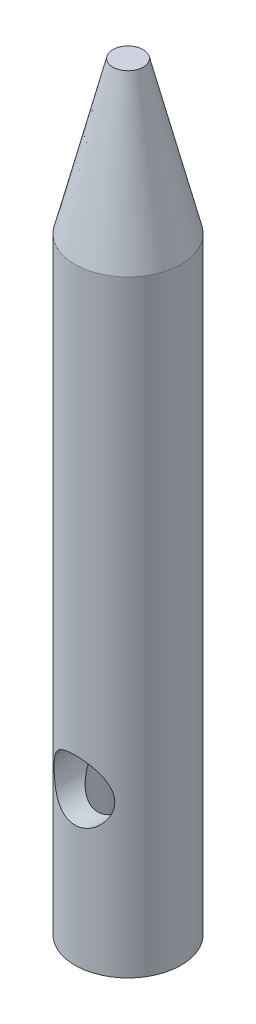
ISO-10303-21;
HEADER;
FILE_DESCRIPTION(('STEP AP214'),'2;1');
FILE_NAME('part.step','',(''),(''),'','','');
FILE_SCHEMA(('AUTOMOTIVE_DESIGN { 1 0 10303 214 1 1 1 1 }'));
ENDSEC;
DATA;
#1=APPLICATION_CONTEXT('core data for automotive mechanical design processes');
#2=APPLICATION_PROTOCOL_DEFINITION('international standard','automotive_design',2000,#1);
#3=PRODUCT_CONTEXT('',#1,'mechanical');
#4=PRODUCT('Part','Part','',(#3));
#5=PRODUCT_RELATED_PRODUCT_CATEGORY('part','',(#4));
#6=PRODUCT_DEFINITION_FORMATION('','',#4);
#7=PRODUCT_DEFINITION_CONTEXT('part definition',#1,'design');
#8=PRODUCT_DEFINITION('design','',#6,#7);
#9=PRODUCT_DEFINITION_SHAPE('','',#8);
#10=(LENGTH_UNIT() NAMED_UNIT(*) SI_UNIT(.MILLI.,.METRE.));
#11=(NAMED_UNIT(*) PLANE_ANGLE_UNIT() SI_UNIT($,.RADIAN.));
#12=(NAMED_UNIT(*) SI_UNIT($,.STERADIAN.) SOLID_ANGLE_UNIT());
#13=UNCERTAINTY_MEASURE_WITH_UNIT(LENGTH_MEASURE(1.E-05),#10,'distance_accuracy_value','');
#14=(GEOMETRIC_REPRESENTATION_CONTEXT(3) GLOBAL_UNCERTAINTY_ASSIGNED_CONTEXT((#13)) GLOBAL_UNIT_ASSIGNED_CONTEXT((#10,
#11,#12)) REPRESENTATION_CONTEXT('',''));
#15=CARTESIAN_POINT('',(0.,0.,0.));
#16=DIRECTION('',(0.,0.,1.));
#17=DIRECTION('',(1.,0.,0.));
#18=AXIS2_PLACEMENT_3D('',#15,#16,#17);
#19=CARTESIAN_POINT('',(0.,0.,0.));
#20=DIRECTION('',(0.,-1.,0.));
#21=DIRECTION('',(0.,0.,-1.));
#22=AXIS2_PLACEMENT_3D('',#19,#20,#21);
#23=CYLINDRICAL_SURFACE('',#22,0.2);
#24=CARTESIAN_POINT('',(0.,0.,0.));
#25=DIRECTION('',(0.,-1.,0.));
#26=DIRECTION('',(0.,0.,-1.));
#27=AXIS2_PLACEMENT_3D('',#24,#25,#26);
#28=CIRCLE('',#27,0.2);
#29=CARTESIAN_POINT('',(0.,0.,-0.2));
#30=VERTEX_POINT('',#29);
#31=EDGE_CURVE('E11',#30,#30,#28,.T.);
#32=ORIENTED_EDGE('',*,*,#31,.T.);
#33=EDGE_LOOP('',(#32));
#34=FACE_BOUND('',#33,.T.);
#35=CARTESIAN_POINT('',(0.,1.,0.));
#36=DIRECTION('',(0.,-0.707106781186547,-0.707106781186547));
#37=DIRECTION('',(0.,-0.707106781186547,0.707106781186547));
#38=AXIS2_PLACEMENT_3D('',#35,#36,#37);
#39=ELLIPSE('',#38,0.282842712474619,0.2);
#40=CARTESIAN_POINT('',(-0.2,1.,0.));
#41=VERTEX_POINT('',#40);
#42=CARTESIAN_POINT('',(0.2,1.,0.));
#43=VERTEX_POINT('',#42);
#44=EDGE_CURVE('E55',#41,#43,#39,.F.);
#45=ORIENTED_EDGE('',*,*,#44,.T.);
#46=CARTESIAN_POINT('',(0.,1.,0.));
#47=DIRECTION('',(0.,-0.707106781186547,0.707106781186547));
#48=DIRECTION('',(0.,-0.707106781186547,-0.707106781186547));
#49=AXIS2_PLACEMENT_3D('',#46,#47,#48);
#50=ELLIPSE('',#49,0.282842712474619,0.2);
#51=EDGE_CURVE('E63',#43,#41,#50,.F.);
#52=ORIENTED_EDGE('',*,*,#51,.T.);
#53=EDGE_LOOP('',(#45,#52));
#54=FACE_BOUND('',#53,.T.);
#55=ADVANCED_FACE('F34',(#34,#54),#23,.F.);
#56=CARTESIAN_POINT('',(-0.35,0.,0.));
#57=DIRECTION('',(0.,1.,0.));
#58=DIRECTION('',(0.,0.,1.));
#59=AXIS2_PLACEMENT_3D('',#56,#57,#58);
#60=PLANE('',#59);
#61=ORIENTED_EDGE('',*,*,#31,.F.);
#62=EDGE_LOOP('',(#61));
#63=FACE_BOUND('',#62,.T.);
#64=CARTESIAN_POINT('',(0.,0.,0.));
#65=DIRECTION('',(0.,-1.,0.));
#66=DIRECTION('',(0.,0.,-1.));
#67=AXIS2_PLACEMENT_3D('',#64,#65,#66);
#68=CIRCLE('',#67,0.35);
#69=CARTESIAN_POINT('',(0.,0.,-0.35));
#70=VERTEX_POINT('',#69);
#71=EDGE_CURVE('E71',#70,#70,#68,.T.);
#72=ORIENTED_EDGE('',*,*,#71,.T.);
#73=EDGE_LOOP('',(#72));
#74=FACE_BOUND('',#73,.T.);
#75=ADVANCED_FACE('F36',(#63,#74),#60,.F.);
#76=CARTESIAN_POINT('',(0.,5.,0.));
#77=DIRECTION('',(0.,-1.,0.));
#78=DIRECTION('',(0.,0.,-1.));
#79=AXIS2_PLACEMENT_3D('',#76,#77,#78);
#80=PLANE('',#79);
#81=CARTESIAN_POINT('',(0.,5.,0.));
#82=DIRECTION('',(0.,-1.,0.));
#83=DIRECTION('',(0.,0.,-1.));
#84=AXIS2_PLACEMENT_3D('',#81,#82,#83);
#85=CIRCLE('',#84,0.100000000000001);
#86=CARTESIAN_POINT('',(0.,5.,-0.100000000000001));
#87=VERTEX_POINT('',#86);
#88=EDGE_CURVE('E82',#87,#87,#85,.T.);
#89=ORIENTED_EDGE('',*,*,#88,.F.);
#90=EDGE_LOOP('',(#89));
#91=FACE_BOUND('',#90,.T.);
#92=ADVANCED_FACE('F112',(#91),#80,.F.);
#93=CARTESIAN_POINT('',(0.,5.,0.));
#94=DIRECTION('',(0.,-1.,0.));
#95=DIRECTION('',(0.,0.,-1.));
#96=AXIS2_PLACEMENT_3D('',#93,#94,#95);
#97=CONICAL_SURFACE('',#96,0.100000000000001,0.244978663126864);
#98=CARTESIAN_POINT('',(0.,4.,0.));
#99=DIRECTION('',(0.,-1.,0.));
#100=DIRECTION('',(0.,0.,-1.));
#101=AXIS2_PLACEMENT_3D('',#98,#99,#100);
#102=CIRCLE('',#101,0.35);
#103=CARTESIAN_POINT('',(0.,4.,-0.35));
#104=VERTEX_POINT('',#103);
#105=EDGE_CURVE('E79',#104,#104,#102,.T.);
#106=CARTESIAN_POINT('',(0.,4.,-0.35));
#107=CARTESIAN_POINT('',(0.,4.01041666666667,-0.347395833333334));
#108=CARTESIAN_POINT('',(0.,4.02083333333333,-0.344791666666667));
#109=CARTESIAN_POINT('',(0.,4.04166666666667,-0.339583333333334));
#110=CARTESIAN_POINT('',(0.,4.05208333333333,-0.336979166666667));
#111=CARTESIAN_POINT('',(0.,4.07291666666667,-0.331770833333334));
#112=CARTESIAN_POINT('',(0.,4.08333333333333,-0.329166666666667));
#113=CARTESIAN_POINT('',(0.,4.10416666666667,-0.323958333333334));
#114=CARTESIAN_POINT('',(0.,4.11458333333333,-0.321354166666667));
#115=CARTESIAN_POINT('',(0.,4.13541666666667,-0.316145833333334));
#116=CARTESIAN_POINT('',(0.,4.14583333333333,-0.313541666666667));
#117=CARTESIAN_POINT('',(0.,4.16666666666667,-0.308333333333334));
#118=CARTESIAN_POINT('',(0.,4.17708333333333,-0.305729166666667));
#119=CARTESIAN_POINT('',(0.,4.19791666666667,-0.300520833333334));
#120=CARTESIAN_POINT('',(0.,4.20833333333333,-0.297916666666667));
#121=CARTESIAN_POINT('',(0.,4.22916666666667,-0.292708333333334));
#122=CARTESIAN_POINT('',(0.,4.23958333333333,-0.290104166666667));
#123=CARTESIAN_POINT('',(0.,4.26041666666667,-0.284895833333334));
#124=CARTESIAN_POINT('',(0.,4.27083333333333,-0.282291666666667));
#125=CARTESIAN_POINT('',(0.,4.29166666666667,-0.277083333333334));
#126=CARTESIAN_POINT('',(0.,4.30208333333333,-0.274479166666667));
#127=CARTESIAN_POINT('',(0.,4.32291666666667,-0.269270833333334));
#128=CARTESIAN_POINT('',(0.,4.33333333333333,-0.266666666666667));
#129=CARTESIAN_POINT('',(0.,4.35416666666667,-0.261458333333334));
#130=CARTESIAN_POINT('',(0.,4.36458333333333,-0.258854166666667));
#131=CARTESIAN_POINT('',(0.,4.38541666666667,-0.253645833333334));
#132=CARTESIAN_POINT('',(0.,4.39583333333333,-0.251041666666667));
#133=CARTESIAN_POINT('',(0.,4.41666666666667,-0.245833333333334));
#134=CARTESIAN_POINT('',(0.,4.42708333333333,-0.243229166666667));
#135=CARTESIAN_POINT('',(0.,4.44791666666667,-0.238020833333334));
#136=CARTESIAN_POINT('',(0.,4.45833333333333,-0.235416666666667));
#137=CARTESIAN_POINT('',(0.,4.47916666666667,-0.230208333333334));
#138=CARTESIAN_POINT('',(0.,4.48958333333333,-0.227604166666667));
#139=CARTESIAN_POINT('',(0.,4.51041666666667,-0.222395833333334));
#140=CARTESIAN_POINT('',(0.,4.52083333333333,-0.219791666666667));
#141=CARTESIAN_POINT('',(0.,4.54166666666667,-0.214583333333334));
#142=CARTESIAN_POINT('',(0.,4.55208333333333,-0.211979166666667));
#143=CARTESIAN_POINT('',(0.,4.57291666666667,-0.206770833333334));
#144=CARTESIAN_POINT('',(0.,4.58333333333333,-0.204166666666667));
#145=CARTESIAN_POINT('',(0.,4.60416666666667,-0.198958333333334));
#146=CARTESIAN_POINT('',(0.,4.61458333333333,-0.196354166666667));
#147=CARTESIAN_POINT('',(0.,4.63541666666667,-0.191145833333334));
#148=CARTESIAN_POINT('',(0.,4.64583333333333,-0.188541666666667));
#149=CARTESIAN_POINT('',(0.,4.66666666666667,-0.183333333333334));
#150=CARTESIAN_POINT('',(0.,4.67708333333333,-0.180729166666667));
#151=CARTESIAN_POINT('',(0.,4.69791666666667,-0.175520833333334));
#152=CARTESIAN_POINT('',(0.,4.70833333333333,-0.172916666666667));
#153=CARTESIAN_POINT('',(0.,4.72916666666667,-0.167708333333334));
#154=CARTESIAN_POINT('',(0.,4.73958333333333,-0.165104166666667));
#155=CARTESIAN_POINT('',(0.,4.76041666666667,-0.159895833333334));
#156=CARTESIAN_POINT('',(0.,4.77083333333333,-0.157291666666667));
#157=CARTESIAN_POINT('',(0.,4.79166666666667,-0.152083333333334));
#158=CARTESIAN_POINT('',(0.,4.80208333333333,-0.149479166666667));
#159=CARTESIAN_POINT('',(0.,4.82291666666667,-0.144270833333334));
#160=CARTESIAN_POINT('',(0.,4.83333333333333,-0.141666666666667));
#161=CARTESIAN_POINT('',(0.,4.85416666666667,-0.136458333333334));
#162=CARTESIAN_POINT('',(0.,4.86458333333333,-0.133854166666667));
#163=CARTESIAN_POINT('',(0.,4.88541666666667,-0.128645833333334));
#164=CARTESIAN_POINT('',(0.,4.89583333333333,-0.126041666666667));
#165=CARTESIAN_POINT('',(0.,4.91666666666667,-0.120833333333334));
#166=CARTESIAN_POINT('',(0.,4.92708333333333,-0.118229166666667));
#167=CARTESIAN_POINT('',(0.,4.94791666666667,-0.113020833333334));
#168=CARTESIAN_POINT('',(0.,4.95833333333333,-0.110416666666667));
#169=CARTESIAN_POINT('',(0.,4.97916666666667,-0.105208333333334));
#170=CARTESIAN_POINT('',(0.,4.98958333333333,-0.102604166666667));
#171=CARTESIAN_POINT('',(0.,5.,-0.100000000000001));
#172=B_SPLINE_CURVE_WITH_KNOTS('',3,(#106,#107,#108,#109,#110,#111,#112,#113,#114,#115,#116,
#117,#118,#119,#120,#121,#122,#123,#124,#125,#126,#127,#128,#129,#130,#131,#132,#133,#134,#135,
#136,#137,#138,#139,#140,#141,#142,#143,#144,#145,#146,#147,#148,#149,#150,#151,#152,#153,#154,
#155,#156,#157,#158,#159,#160,#161,#162,#163,#164,#165,#166,#167,#168,#169,#170,#171),
.UNSPECIFIED.,.F.,.F.,(4,2,2,2,2,2,2,2,2,2,2,2,2,2,2,2,2,2,2,2,2,2,2,2,2,2,2,2,2,2,2,2,4),(0.,
0.032211762700138,0.064423525400276,0.096635288100414,0.128847050800552,0.16105881350069,
0.193270576200828,0.225482338900966,0.257694101601104,0.289905864301242,0.32211762700138,
0.354329389701518,0.386541152401656,0.418752915101794,0.450964677801932,0.48317644050207,
0.515388203202208,0.547599965902346,0.579811728602484,0.612023491302622,0.64423525400276,
0.676447016702898,0.708658779403036,0.740870542103174,0.773082304803312,0.80529406750345,
0.837505830203588,0.869717592903726,0.901929355603864,0.934141118304002,0.96635288100414,
0.998564643704278,1.03077640640442),.UNSPECIFIED.);
#173=EDGE_CURVE('BSEAM133',#104,#87,#172,.T.);
#174=ORIENTED_EDGE('',*,*,#105,.F.);
#175=ORIENTED_EDGE('',*,*,#88,.T.);
#176=ORIENTED_EDGE('',*,*,#173,.T.);
#177=ORIENTED_EDGE('',*,*,#173,.F.);
#178=EDGE_LOOP('',(#174,#176,#175,#177));
#179=FACE_BOUND('',#178,.T.);
#180=ADVANCED_FACE('F133',(#179),#97,.T.);
#181=CARTESIAN_POINT('',(0.,0.,0.));
#182=DIRECTION('',(0.,-1.,0.));
#183=DIRECTION('',(0.,0.,-1.));
#184=AXIS2_PLACEMENT_3D('',#181,#182,#183);
#185=CYLINDRICAL_SURFACE('',#184,0.35);
#186=CARTESIAN_POINT('',(0.,1.2,-0.35));
#187=CARTESIAN_POINT('',(-0.0103137633713756,1.19999876478273,-0.349998930544013));
#188=CARTESIAN_POINT('',(-0.0206422734256984,1.19919674742983,-0.349539051709204));
#189=CARTESIAN_POINT('',(-0.0409933767093107,1.19602603667917,-0.347742132318733));
#190=CARTESIAN_POINT('',(-0.0510151115294479,1.19365330488609,-0.346402830789807));
#191=CARTESIAN_POINT('',(-0.0704137878038646,1.18747006739084,-0.342984596297375));
#192=CARTESIAN_POINT('',(-0.0797935488228526,1.18366639927172,-0.340909183422635));
#193=CARTESIAN_POINT('',(-0.0977565699945647,1.17476902760964,-0.336199342025411));
#194=CARTESIAN_POINT('',(-0.106340051171244,1.1696756835157,-0.333565069297356));
#195=CARTESIAN_POINT('',(-0.123168344046356,1.15793141604813,-0.327741425104897));
#196=CARTESIAN_POINT('',(-0.131343892888419,1.15119455155795,-0.324525700186589));
#197=CARTESIAN_POINT('',(-0.146516454500345,1.13654426694702,-0.31796447699383));
#198=CARTESIAN_POINT('',(-0.153512064477469,1.12862946715736,-0.314618829989264));
#199=CARTESIAN_POINT('',(-0.166894421303945,1.11083035772255,-0.307747838458372));
#200=CARTESIAN_POINT('',(-0.17313237753777,1.10082548711314,-0.304242478886067));
#201=CARTESIAN_POINT('',(-0.183811251661301,1.07970497289213,-0.297913019998135));
#202=CARTESIAN_POINT('',(-0.188254890035744,1.06859104295207,-0.295087891983905));
#203=CARTESIAN_POINT('',(-0.194359344849944,1.04808548353295,-0.291092239002123));
#204=CARTESIAN_POINT('',(-0.196418339952736,1.03885684851674,-0.289693926376122));
#205=CARTESIAN_POINT('',(-0.199210676215421,1.02011502636096,-0.287781339696641));
#206=CARTESIAN_POINT('',(-0.199945438410471,1.01060215539654,-0.287266118026827));
#207=CARTESIAN_POINT('',(-0.200048758471699,0.991552531514157,-0.2871941873633));
#208=CARTESIAN_POINT('',(-0.199415450552132,0.982015763721244,-0.287638787382113));
#209=CARTESIAN_POINT('',(-0.196816496401727,0.963209749567018,-0.289422948006508));
#210=CARTESIAN_POINT('',(-0.194849933467719,0.953940691849278,-0.290763124372431));
#211=CARTESIAN_POINT('',(-0.189691752764124,0.935933506937481,-0.294153701069832));
#212=CARTESIAN_POINT('',(-0.186504898447889,0.927193466441864,-0.2962013368077));
#213=CARTESIAN_POINT('',(-0.17901699553948,0.910345014740466,-0.300785886726075));
#214=CARTESIAN_POINT('',(-0.174715520650386,0.90223684674684,-0.303322988012138));
#215=CARTESIAN_POINT('',(-0.164323768381055,0.885502710460292,-0.309092813686719));
#216=CARTESIAN_POINT('',(-0.158057296974719,0.877001985826451,-0.312371858594242));
#217=CARTESIAN_POINT('',(-0.144275323922769,0.861091568050594,-0.318971935686018));
#218=CARTESIAN_POINT('',(-0.136758757586163,0.853682815161013,-0.322293001412018));
#219=CARTESIAN_POINT('',(-0.119664071603784,0.839317579858433,-0.329050445600129));
#220=CARTESIAN_POINT('',(-0.109948658535053,0.832508704888142,-0.332456879733462));
#221=CARTESIAN_POINT('',(-0.0893015490655802,0.820649320854548,-0.338586602557162));
#222=CARTESIAN_POINT('',(-0.0783706249477172,0.815597703634876,-0.341310321475285));
#223=CARTESIAN_POINT('',(-0.0563793778179125,0.807781607577393,-0.345598032097026));
#224=CARTESIAN_POINT('',(-0.0453802193453631,0.804883178938477,-0.347229170031787));
#225=CARTESIAN_POINT('',(-0.0229493069556982,0.800996184112126,-0.349427902499712));
#226=CARTESIAN_POINT('',(-0.0115179910205493,0.80000573447666,-0.34999654585023));
#227=CARTESIAN_POINT('',(0.00995234593134536,0.799994998886615,-0.350003013582763));
#228=CARTESIAN_POINT('',(0.0199920938989525,0.800750353381575,-0.349569611836485));
#229=CARTESIAN_POINT('',(0.0397754958971078,0.803740057339511,-0.347874174583042));
#230=CARTESIAN_POINT('',(0.0495191448486255,0.805974432157383,-0.346612124870339));
#231=CARTESIAN_POINT('',(0.0683570804723404,0.811788463846716,-0.343391644887802));
#232=CARTESIAN_POINT('',(0.0774570013012234,0.815354090994125,-0.341440488141792));
#233=CARTESIAN_POINT('',(0.0949355356164595,0.823701573604684,-0.336999496877669));
#234=CARTESIAN_POINT('',(0.103313974782479,0.828483721899349,-0.3345095326836));
#235=CARTESIAN_POINT('',(0.12005099711777,0.839689384085905,-0.328897467992497));
#236=CARTESIAN_POINT('',(0.128316737085758,0.846231933816732,-0.325736546623625));
#237=CARTESIAN_POINT('',(0.143697220197717,0.860496166111818,-0.319250590832059));
#238=CARTESIAN_POINT('',(0.150810627029033,0.868219197752364,-0.315925371627119));
#239=CARTESIAN_POINT('',(0.164492727997804,0.885640252382802,-0.309042173576713));
#240=CARTESIAN_POINT('',(0.170912186717738,0.895462479866779,-0.305499597340533));
#241=CARTESIAN_POINT('',(0.181993376294319,0.916235463133991,-0.299031347365693));
#242=CARTESIAN_POINT('',(0.186657443128426,0.927184694261494,-0.29610485607864));
#243=CARTESIAN_POINT('',(0.193222109233617,0.947523526415878,-0.291851233596818));
#244=CARTESIAN_POINT('',(0.195499953465304,0.95674764916306,-0.290316106114746));
#245=CARTESIAN_POINT('',(0.198724336733945,0.97552340929629,-0.288119032880242));
#246=CARTESIAN_POINT('',(0.199672390609477,0.985074661298821,-0.287456093622934));
#247=CARTESIAN_POINT('',(0.200185191677465,1.00425227697593,-0.287099311887075));
#248=CARTESIAN_POINT('',(0.199747153848269,1.01387875305667,-0.2874074204933));
#249=CARTESIAN_POINT('',(0.19750838376924,1.03289771506714,-0.288950140141947));
#250=CARTESIAN_POINT('',(0.19570678964257,1.04229004912025,-0.290185337174424));
#251=CARTESIAN_POINT('',(0.190877044137355,1.06043756332218,-0.293383807744768));
#252=CARTESIAN_POINT('',(0.187870654270717,1.06920095589756,-0.295334114159182));
#253=CARTESIAN_POINT('',(0.1807421898435,1.08611990950169,-0.299749553228983));
#254=CARTESIAN_POINT('',(0.176619703864873,1.09427524497029,-0.302214875654131));
#255=CARTESIAN_POINT('',(0.166643167425522,1.11108433360805,-0.307843523342815));
#256=CARTESIAN_POINT('',(0.160620231366455,1.11962145930068,-0.311055874313167));
#257=CARTESIAN_POINT('',(0.147338606531218,1.1356457621163,-0.317562733712144));
#258=CARTESIAN_POINT('',(0.140078845686174,1.14313201799892,-0.320857311281484));
#259=CARTESIAN_POINT('',(0.12345478348927,1.15778607761002,-0.327641814497145));
#260=CARTESIAN_POINT('',(0.113941003655711,1.16479825914288,-0.331105012510977));
#261=CARTESIAN_POINT('',(0.0936681847964059,1.17710585795227,-0.337399606263743));
#262=CARTESIAN_POINT('',(0.0829098475795821,1.1824022364319,-0.340231355465969));
#263=CARTESIAN_POINT('',(0.0624381425690691,1.19026177881628,-0.34451532091275));
#264=CARTESIAN_POINT('',(0.0528790185434741,1.19314345567461,-0.346123290138661));
#265=CARTESIAN_POINT('',(0.0333576138353662,1.19744999837248,-0.348544434076357));
#266=CARTESIAN_POINT('',(0.0233965852105429,1.19887907261361,-0.349359904469659));
#267=CARTESIAN_POINT('',(0.00892909346661869,1.19985092718937,-0.349914901768206));
#268=CARTESIAN_POINT('',(0.00446592919685434,1.20000053485742,-0.350000463081666));
#269=CARTESIAN_POINT('',(0.,1.2,-0.35));
#270=B_SPLINE_CURVE_WITH_KNOTS('',3,(#186,#187,#188,#189,#190,#191,#192,#193,#194,#195,#196,
#197,#198,#199,#200,#201,#202,#203,#204,#205,#206,#207,#208,#209,#210,#211,#212,#213,#214,#215,
#216,#217,#218,#219,#220,#221,#222,#223,#224,#225,#226,#227,#228,#229,#230,#231,#232,#233,#234,
#235,#236,#237,#238,#239,#240,#241,#242,#243,#244,#245,#246,#247,#248,#249,#250,#251,#252,#253,
#254,#255,#256,#257,#258,#259,#260,#261,#262,#263,#264,#265,#266,#267,#268,#269),.UNSPECIFIED.,
.T.,.F.,(4,2,2,2,2,2,2,2,2,2,2,2,2,2,2,2,2,2,2,2,2,2,2,2,2,2,2,2,2,2,2,2,2,2,2,2,2,2,2,2,2,4),
(0.,0.0309268603260588,0.0619335457908361,0.0927939130491701,0.123645688582088,
0.156726264134176,0.189845895106408,0.22656484043951,0.263227902790326,0.291779157002758,
0.320299754562449,0.348859273311803,0.377438448607168,0.405907182915263,0.434386821465276,
0.467430361731442,0.500502190277474,0.537340568255365,0.574155673036686,0.60842618095814,
0.642662841618566,0.672747547984674,0.702832770107277,0.732609492531286,0.762393389370003,
0.795277462996164,0.828199402066336,0.864793130617147,0.90133798863473,0.930087929264483,
0.958805092556715,0.987579992770442,1.01637309623194,1.04466801483725,1.07297337781877,
1.10563737116695,1.13832982278444,1.17509152683508,1.21183260100354,1.24204193491264,
1.27216349635519,1.28555503575006),.UNSPECIFIED.);
#271=CARTESIAN_POINT('',(0.,1.2,-0.35));
#272=VERTEX_POINT('',#271);
#273=EDGE_CURVE('E38',#272,#272,#270,.T.);
#274=ORIENTED_EDGE('',*,*,#273,.T.);
#275=EDGE_LOOP('',(#274));
#276=FACE_BOUND('',#275,.T.);
#277=CARTESIAN_POINT('',(0.2,1.,0.287228132326902));
#278=CARTESIAN_POINT('',(0.199999795574422,0.989824071707422,0.287228454570406));
#279=CARTESIAN_POINT('',(0.199218519270851,0.97964667283571,0.287777067592459));
#280=CARTESIAN_POINT('',(0.196144931078096,0.95962654045965,0.289880046719518));
#281=CARTESIAN_POINT('',(0.193851008064158,0.949784175568541,0.291435485164933));
#282=CARTESIAN_POINT('',(0.187896057659059,0.93076214993464,0.29530907625565));
#283=CARTESIAN_POINT('',(0.184243903139666,0.921578639716486,0.297622267317477));
#284=CARTESIAN_POINT('',(0.175704253700131,0.903958400102295,0.302742059279572));
#285=CARTESIAN_POINT('',(0.170816362796526,0.895521911256564,0.305548818252442));
#286=CARTESIAN_POINT('',(0.159317521330899,0.878618065870515,0.311712928789809));
#287=CARTESIAN_POINT('',(0.152576320709179,0.87024899346755,0.315096898365728));
#288=CARTESIAN_POINT('',(0.137830388140012,0.854680209213615,0.321820634491318));
#289=CARTESIAN_POINT('',(0.129824840205109,0.847481258669342,0.325160370974557));
#290=CARTESIAN_POINT('',(0.111854160270882,0.833783291506497,0.331796239640569));
#291=CARTESIAN_POINT('',(0.101775177832484,0.82741545717586,0.335058180750354));
#292=CARTESIAN_POINT('',(0.0804671960590391,0.816511913000519,0.340802542899649));
#293=CARTESIAN_POINT('',(0.069239157031421,0.811974688674732,0.343285607930658));
#294=CARTESIAN_POINT('',(0.0470016279358293,0.805286189960607,0.346996336372138));
#295=CARTESIAN_POINT('',(0.0360605805974349,0.802959435836291,0.348315582593055));
#296=CARTESIAN_POINT('',(0.013871371211644,0.800169299604951,0.349901289726849));
#297=CARTESIAN_POINT('',(0.00262347176942166,0.799704371572088,0.35016862406812));
#298=CARTESIAN_POINT('',(-0.0184946963787956,0.800608689984018,0.349652510241004));
#299=CARTESIAN_POINT('',(-0.0283772577168577,0.801776975643908,0.348984178266428));
#300=CARTESIAN_POINT('',(-0.0477779282720162,0.805539452444606,0.346860910566025));
#301=CARTESIAN_POINT('',(-0.0572960106221636,0.808133748485748,0.345405916971839));
#302=CARTESIAN_POINT('',(-0.0758178496763568,0.814665099229942,0.341820908136946));
#303=CARTESIAN_POINT('',(-0.0848162877384954,0.818613874742238,0.339685012593584));
#304=CARTESIAN_POINT('',(-0.102037827752191,0.827711784115966,0.334915268758867));
#305=CARTESIAN_POINT('',(-0.110260700078914,0.832861271919931,0.33228127368251));
#306=CARTESIAN_POINT('',(-0.126692918503186,0.844874592132402,0.326394555301744));
#307=CARTESIAN_POINT('',(-0.134795656057991,0.851866415839957,0.323105548166149));
#308=CARTESIAN_POINT('',(-0.149778980710802,0.86703346595053,0.316439037237392));
#309=CARTESIAN_POINT('',(-0.156658064651003,0.875210125767827,0.313061430368862));
#310=CARTESIAN_POINT('',(-0.169686219897269,0.893488022285359,0.306212243143725));
#311=CARTESIAN_POINT('',(-0.175694261459526,0.903699844164044,0.302764831167346));
#312=CARTESIAN_POINT('',(-0.185868169503516,0.925207752583691,0.296628701863718));
#313=CARTESIAN_POINT('',(-0.190037300063656,0.93650187429027,0.293938643325517));
#314=CARTESIAN_POINT('',(-0.195587400148596,0.95719095907647,0.290265363223014));
#315=CARTESIAN_POINT('',(-0.197388069307126,0.966429134279582,0.289032429585663));
#316=CARTESIAN_POINT('',(-0.199669026161666,0.985138817160011,0.287461858924007));
#317=CARTESIAN_POINT('',(-0.200150579794895,0.994610092318435,0.287123363530537));
#318=CARTESIAN_POINT('',(-0.19976686309119,1.0135163431742,0.287390377684484));
#319=CARTESIAN_POINT('',(-0.198900796377874,1.02295129410213,0.287996445421919));
#320=CARTESIAN_POINT('',(-0.195870152830819,1.04151495957625,0.29006574775467));
#321=CARTESIAN_POINT('',(-0.193704629982478,1.05064344589629,0.291529606810779));
#322=CARTESIAN_POINT('',(-0.188140846835327,1.06849532819092,0.295150911588424));
#323=CARTESIAN_POINT('',(-0.184727488276401,1.07721221947902,0.297316813691575));
#324=CARTESIAN_POINT('',(-0.176785702988746,1.09398419587632,0.302106419586968));
#325=CARTESIAN_POINT('',(-0.1722568213872,1.10203900922094,0.304730310003968));
#326=CARTESIAN_POINT('',(-0.161341400894269,1.11867473184882,0.310666399742933));
#327=CARTESIAN_POINT('',(-0.154771199603915,1.12712047148759,0.314020508069561));
#328=CARTESIAN_POINT('',(-0.140365915117554,1.14286857212525,0.320718874487804));
#329=CARTESIAN_POINT('',(-0.132529785443711,1.15016997723825,0.32406312207891));
#330=CARTESIAN_POINT('',(-0.11486749469659,1.16414787390584,0.330761562309973));
#331=CARTESIAN_POINT('',(-0.104920745926269,1.17068912634182,0.334083391106925));
#332=CARTESIAN_POINT('',(-0.0838502048903258,1.1819658447233,0.339983021541056));
#333=CARTESIAN_POINT('',(-0.0727273517759619,1.18670273779256,0.342561410793645));
#334=CARTESIAN_POINT('',(-0.050569756822564,1.19382164247036,0.346494999115034));
#335=CARTESIAN_POINT('',(-0.0396016146177104,1.19636402141799,0.347932715272042));
#336=CARTESIAN_POINT('',(-0.0173110532524938,1.19956646331974,0.349749840717739));
#337=CARTESIAN_POINT('',(-0.00598895624756798,1.20022819028205,0.350130185566166));
#338=CARTESIAN_POINT('',(0.0152663446388147,1.19966629930359,0.34980950736595));
#339=CARTESIAN_POINT('',(0.0252078181064032,1.19865316276306,0.349229198229488));
#340=CARTESIAN_POINT('',(0.044751642437318,1.19518141403517,0.347266080925354));
#341=CARTESIAN_POINT('',(0.0543539754940795,1.19272272606841,0.345883230686522));
#342=CARTESIAN_POINT('',(0.0729940626918306,1.18646387409123,0.342435356756899));
#343=CARTESIAN_POINT('',(0.0820308611690926,1.18266150788743,0.34036921355616));
#344=CARTESIAN_POINT('',(0.0993497634912731,1.1738508608317,0.335723286822077));
#345=CARTESIAN_POINT('',(0.107631659934331,1.16884224994432,0.333143362748848));
#346=CARTESIAN_POINT('',(0.124182171167654,1.15713852762274,0.327358852164431));
#347=CARTESIAN_POINT('',(0.132349322177474,1.150318571721,0.324116776376456));
#348=CARTESIAN_POINT('',(0.147489022304019,1.13549693048814,0.317514349357915));
#349=CARTESIAN_POINT('',(0.154460124934564,1.12749383574764,0.314153860755918));
#350=CARTESIAN_POINT('',(0.167746044899173,1.1095386983968,0.307282960159727));
#351=CARTESIAN_POINT('',(0.173915916122719,1.09947035550981,0.303793640810932));
#352=CARTESIAN_POINT('',(0.184444649266477,1.07823081720529,0.297519675447434));
#353=CARTESIAN_POINT('',(0.188806476764546,1.06706146523217,0.294733878462725));
#354=CARTESIAN_POINT('',(0.194723136206288,1.04657257608753,0.290847763385743));
#355=CARTESIAN_POINT('',(0.196692818357548,1.03741836592388,0.289507162941057));
#356=CARTESIAN_POINT('',(0.199330737579489,1.01884301912002,0.287697604965808));
#357=CARTESIAN_POINT('',(0.200000189282624,1.00942213995018,0.28722783395379));
#358=CARTESIAN_POINT('',(0.2,1.,0.287228132326902));
#359=B_SPLINE_CURVE_WITH_KNOTS('',3,(#277,#278,#279,#280,#281,#282,#283,#284,#285,#286,#287,
#288,#289,#290,#291,#292,#293,#294,#295,#296,#297,#298,#299,#300,#301,#302,#303,#304,#305,#306,
#307,#308,#309,#310,#311,#312,#313,#314,#315,#316,#317,#318,#319,#320,#321,#322,#323,#324,#325,
#326,#327,#328,#329,#330,#331,#332,#333,#334,#335,#336,#337,#338,#339,#340,#341,#342,#343,#344,
#345,#346,#347,#348,#349,#350,#351,#352,#353,#354,#355,#356,#357,#358),.UNSPECIFIED.,.T.,.F.,(4,
2,2,2,2,2,2,2,2,2,2,2,2,2,2,2,2,2,2,2,2,2,2,2,2,2,2,2,2,2,2,2,2,2,2,2,2,2,2,2,4),(0.,
0.0304883874922045,0.0610093008270222,0.0913342368016236,0.121668902543367,0.155333694493002,
0.189020302564242,0.225902542593062,0.262754206715988,0.296347760855559,0.32991341554458,
0.359693222039792,0.389475219493689,0.419521719762526,0.449577088274961,0.483030033342326,
0.516523792999545,0.553354788732138,0.590120143516875,0.618472748181874,0.646798133689516,
0.675140264444833,0.703503053576374,0.732221037095133,0.760950750285232,0.794456853113989,
0.827990796791318,0.864873850490141,0.901727671364317,0.935580044650243,0.969402455885487,
0.999288075875144,1.02917526268339,1.05911166140059,1.08905626021165,1.12229136701959,
1.15556638888968,1.19232239847193,1.22901787948671,1.25727422920921,1.28550417006054),.UNSPECIFIED.);
#360=CARTESIAN_POINT('',(0.2,1.,0.287228132326902));
#361=VERTEX_POINT('',#360);
#362=EDGE_CURVE('E86',#361,#361,#359,.T.);
#363=ORIENTED_EDGE('',*,*,#362,.T.);
#364=EDGE_LOOP('',(#363));
#365=FACE_BOUND('',#364,.T.);
#366=ORIENTED_EDGE('',*,*,#71,.F.);
#367=EDGE_LOOP('',(#366));
#368=FACE_BOUND('',#367,.T.);
#369=ORIENTED_EDGE('',*,*,#105,.T.);
#370=EDGE_LOOP('',(#369));
#371=FACE_BOUND('',#370,.T.);
#372=ADVANCED_FACE('F91',(#276,#365,#368,#371),#185,.T.);
#373=CARTESIAN_POINT('',(0.,1.,-5.));
#374=DIRECTION('',(0.,0.,1.));
#375=DIRECTION('',(1.,0.,0.));
#376=AXIS2_PLACEMENT_3D('',#373,#374,#375);
#377=CYLINDRICAL_SURFACE('',#376,0.2);
#378=ORIENTED_EDGE('',*,*,#362,.F.);
#379=EDGE_LOOP('',(#378));
#380=FACE_BOUND('',#379,.T.);
#381=ORIENTED_EDGE('',*,*,#44,.F.);
#382=CARTESIAN_POINT('',(0.,1.,0.));
#383=DIRECTION('',(0.,-0.707106781186547,0.707106781186547));
#384=DIRECTION('',(0.,-0.707106781186547,-0.707106781186547));
#385=AXIS2_PLACEMENT_3D('',#382,#383,#384);
#386=ELLIPSE('',#385,0.282842712474619,0.2);
#387=EDGE_CURVE('E66',#43,#41,#386,.T.);
#388=ORIENTED_EDGE('',*,*,#387,.F.);
#389=EDGE_LOOP('',(#381,#388));
#390=FACE_BOUND('',#389,.T.);
#391=ADVANCED_FACE('F69',(#380,#390),#377,.F.);
#392=ORIENTED_EDGE('',*,*,#273,.F.);
#393=EDGE_LOOP('',(#392));
#394=FACE_BOUND('',#393,.T.);
#395=CARTESIAN_POINT('',(0.,1.,0.));
#396=DIRECTION('',(0.,-0.707106781186547,-0.707106781186547));
#397=DIRECTION('',(0.,-0.707106781186547,0.707106781186547));
#398=AXIS2_PLACEMENT_3D('',#395,#396,#397);
#399=ELLIPSE('',#398,0.282842712474619,0.2);
#400=EDGE_CURVE('E61',#41,#43,#399,.T.);
#401=ORIENTED_EDGE('',*,*,#400,.F.);
#402=ORIENTED_EDGE('',*,*,#51,.F.);
#403=EDGE_LOOP('',(#401,#402));
#404=FACE_BOUND('',#403,.T.);
#405=ADVANCED_FACE('F62',(#394,#404),#377,.F.);
#406=CARTESIAN_POINT('',(-0.2,2.,0.));
#407=DIRECTION('',(0.,1.,0.));
#408=DIRECTION('',(0.,0.,1.));
#409=AXIS2_PLACEMENT_3D('',#406,#407,#408);
#410=PLANE('',#409);
#411=CARTESIAN_POINT('',(0.,2.,0.));
#412=DIRECTION('',(0.,-1.,0.));
#413=DIRECTION('',(0.,0.,-1.));
#414=AXIS2_PLACEMENT_3D('',#411,#412,#413);
#415=CIRCLE('',#414,0.2);
#416=CARTESIAN_POINT('',(0.,2.,-0.2));
#417=VERTEX_POINT('',#416);
#418=EDGE_CURVE('E48',#417,#417,#415,.T.);
#419=ORIENTED_EDGE('',*,*,#418,.T.);
#420=EDGE_LOOP('',(#419));
#421=FACE_BOUND('',#420,.T.);
#422=ADVANCED_FACE('F96',(#421),#410,.F.);
#423=ORIENTED_EDGE('',*,*,#400,.T.);
#424=ORIENTED_EDGE('',*,*,#387,.T.);
#425=EDGE_LOOP('',(#423,#424));
#426=FACE_BOUND('',#425,.T.);
#427=ORIENTED_EDGE('',*,*,#418,.F.);
#428=EDGE_LOOP('',(#427));
#429=FACE_BOUND('',#428,.T.);
#430=ADVANCED_FACE('F73',(#426,#429),#23,.F.);
#431=CLOSED_SHELL('',(#55,#75,#92,#180,#372,#391,#405,#422,#430));
#432=MANIFOLD_SOLID_BREP('B2',#431);
#433=ADVANCED_BREP_SHAPE_REPRESENTATION('',(#18,#432),#14);
#434=SHAPE_DEFINITION_REPRESENTATION(#9,#433);
ENDSEC;
END-ISO-10303-21;
